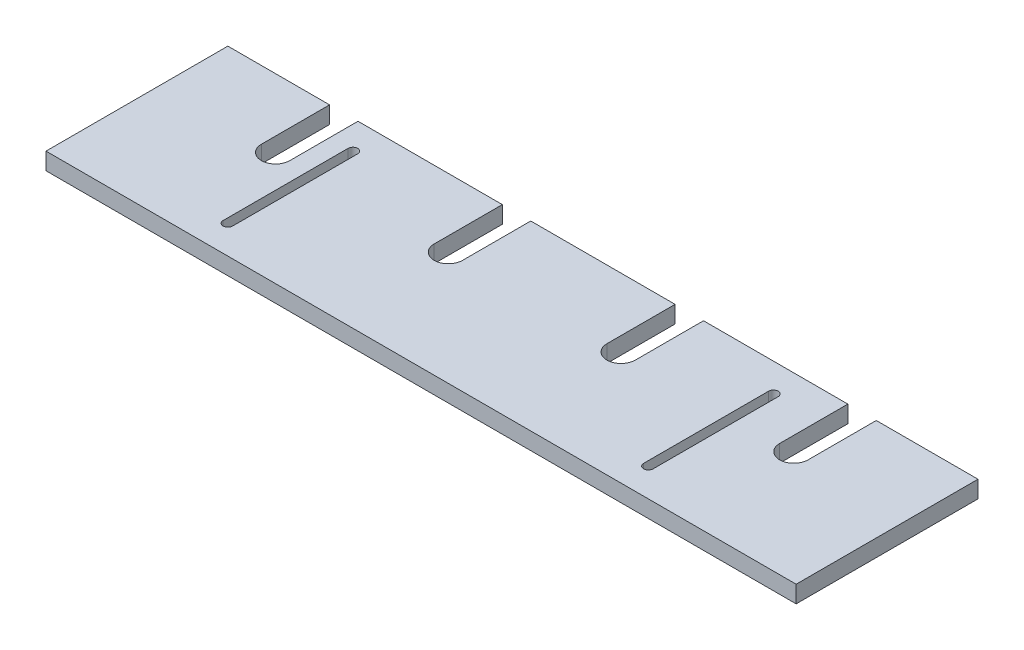
ISO-10303-21;
HEADER;
FILE_DESCRIPTION(('STEP AP214'),'2;1');
FILE_NAME('part.step','',(''),(''),'','','');
FILE_SCHEMA(('AUTOMOTIVE_DESIGN { 1 0 10303 214 1 1 1 1 }'));
ENDSEC;
DATA;
#1=APPLICATION_CONTEXT('core data for automotive mechanical design processes');
#2=APPLICATION_PROTOCOL_DEFINITION('international standard','automotive_design',2000,#1);
#3=PRODUCT_CONTEXT('',#1,'mechanical');
#4=PRODUCT('Part','Part','',(#3));
#5=PRODUCT_RELATED_PRODUCT_CATEGORY('part','',(#4));
#6=PRODUCT_DEFINITION_FORMATION('','',#4);
#7=PRODUCT_DEFINITION_CONTEXT('part definition',#1,'design');
#8=PRODUCT_DEFINITION('design','',#6,#7);
#9=PRODUCT_DEFINITION_SHAPE('','',#8);
#10=(LENGTH_UNIT() NAMED_UNIT(*) SI_UNIT(.MILLI.,.METRE.));
#11=(NAMED_UNIT(*) PLANE_ANGLE_UNIT() SI_UNIT($,.RADIAN.));
#12=(NAMED_UNIT(*) SI_UNIT($,.STERADIAN.) SOLID_ANGLE_UNIT());
#13=UNCERTAINTY_MEASURE_WITH_UNIT(LENGTH_MEASURE(1.E-05),#10,'distance_accuracy_value','');
#14=(GEOMETRIC_REPRESENTATION_CONTEXT(3) GLOBAL_UNCERTAINTY_ASSIGNED_CONTEXT((#13)) GLOBAL_UNIT_ASSIGNED_CONTEXT((#10,
#11,#12)) REPRESENTATION_CONTEXT('',''));
#15=CARTESIAN_POINT('',(0.,0.,0.));
#16=DIRECTION('',(0.,0.,1.));
#17=DIRECTION('',(1.,0.,0.));
#18=AXIS2_PLACEMENT_3D('',#15,#16,#17);
#19=CARTESIAN_POINT('',(-209.55,9.525,-50.8));
#20=DIRECTION('',(0.,0.,1.));
#21=DIRECTION('',(1.,0.,0.));
#22=AXIS2_PLACEMENT_3D('',#19,#20,#21);
#23=PLANE('',#22);
#24=DIRECTION('',(0.,-1.,0.));
#25=VECTOR('',#24,1.);
#26=CARTESIAN_POINT('',(-136.8425,9.526,-50.8));
#27=LINE('',#26,#25);
#28=CARTESIAN_POINT('',(-136.8425,0.,-50.8));
#29=VERTEX_POINT('',#28);
#30=CARTESIAN_POINT('',(-136.8425,9.525,-50.8));
#31=VERTEX_POINT('',#30);
#32=EDGE_CURVE('E334',#29,#31,#27,.F.);
#33=ORIENTED_EDGE('',*,*,#32,.T.);
#34=DIRECTION('',(-1.,0.,0.));
#35=VECTOR('',#34,1.);
#36=CARTESIAN_POINT('',(-209.55,9.525,-50.8));
#37=LINE('',#36,#35);
#38=CARTESIAN_POINT('',(-56.1975,9.525,-50.8));
#39=VERTEX_POINT('',#38);
#40=EDGE_CURVE('E539',#39,#31,#37,.T.);
#41=ORIENTED_EDGE('',*,*,#40,.F.);
#42=DIRECTION('',(0.,-1.,0.));
#43=VECTOR('',#42,1.);
#44=CARTESIAN_POINT('',(-56.1975,9.526,-50.8));
#45=LINE('',#44,#43);
#46=CARTESIAN_POINT('',(-56.1975,0.,-50.8));
#47=VERTEX_POINT('',#46);
#48=EDGE_CURVE('E374',#39,#47,#45,.T.);
#49=ORIENTED_EDGE('',*,*,#48,.T.);
#50=DIRECTION('',(-1.,0.,0.));
#51=VECTOR('',#50,1.);
#52=CARTESIAN_POINT('',(-209.55,0.,-50.8));
#53=LINE('',#52,#51);
#54=EDGE_CURVE('E588',#47,#29,#53,.T.);
#55=ORIENTED_EDGE('',*,*,#54,.T.);
#56=EDGE_LOOP('',(#33,#41,#49,#55));
#57=FACE_BOUND('',#56,.T.);
#58=ADVANCED_FACE('F50',(#57),#23,.F.);
#59=DIRECTION('',(0.,-1.,0.));
#60=VECTOR('',#59,1.);
#61=CARTESIAN_POINT('',(-152.7175,9.526,-50.8));
#62=LINE('',#61,#60);
#63=CARTESIAN_POINT('',(-152.7175,9.525,-50.8));
#64=VERTEX_POINT('',#63);
#65=CARTESIAN_POINT('',(-152.7175,0.,-50.8));
#66=VERTEX_POINT('',#65);
#67=EDGE_CURVE('E330',#64,#66,#62,.T.);
#68=ORIENTED_EDGE('',*,*,#67,.T.);
#69=CARTESIAN_POINT('',(-209.55,0.,-50.8));
#70=VERTEX_POINT('',#69);
#71=EDGE_CURVE('E496',#66,#70,#53,.T.);
#72=ORIENTED_EDGE('',*,*,#71,.T.);
#73=DIRECTION('',(0.,-1.,0.));
#74=VECTOR('',#73,1.);
#75=CARTESIAN_POINT('',(-209.55,9.525,-50.8));
#76=LINE('',#75,#74);
#77=CARTESIAN_POINT('',(-209.55,9.525,-50.8));
#78=VERTEX_POINT('',#77);
#79=EDGE_CURVE('E59',#78,#70,#76,.T.);
#80=ORIENTED_EDGE('',*,*,#79,.F.);
#81=EDGE_CURVE('E479',#64,#78,#37,.T.);
#82=ORIENTED_EDGE('',*,*,#81,.F.);
#83=EDGE_LOOP('',(#68,#72,#80,#82));
#84=FACE_BOUND('',#83,.T.);
#85=ADVANCED_FACE('F597',(#84),#23,.F.);
#86=DIRECTION('',(0.,1.,0.));
#87=VECTOR('',#86,1.);
#88=CARTESIAN_POINT('',(-40.3225,9.526,-50.8));
#89=LINE('',#88,#87);
#90=CARTESIAN_POINT('',(-40.3225,0.,-50.8));
#91=VERTEX_POINT('',#90);
#92=CARTESIAN_POINT('',(-40.3225,9.525,-50.8));
#93=VERTEX_POINT('',#92);
#94=EDGE_CURVE('E256',#91,#93,#89,.T.);
#95=ORIENTED_EDGE('',*,*,#94,.T.);
#96=CARTESIAN_POINT('',(40.3225,9.525,-50.8));
#97=VERTEX_POINT('',#96);
#98=EDGE_CURVE('E542',#97,#93,#37,.T.);
#99=ORIENTED_EDGE('',*,*,#98,.F.);
#100=DIRECTION('',(0.,1.,0.));
#101=VECTOR('',#100,1.);
#102=CARTESIAN_POINT('',(40.3225,9.526,-50.8));
#103=LINE('',#102,#101);
#104=CARTESIAN_POINT('',(40.3225,0.,-50.8));
#105=VERTEX_POINT('',#104);
#106=EDGE_CURVE('E445',#105,#97,#103,.T.);
#107=ORIENTED_EDGE('',*,*,#106,.F.);
#108=EDGE_CURVE('E575',#105,#91,#53,.T.);
#109=ORIENTED_EDGE('',*,*,#108,.T.);
#110=EDGE_LOOP('',(#95,#99,#107,#109));
#111=FACE_BOUND('',#110,.T.);
#112=ADVANCED_FACE('F573',(#111),#23,.F.);
#113=CARTESIAN_POINT('',(0.,9.525,0.));
#114=DIRECTION('',(0.,-1.,0.));
#115=DIRECTION('',(0.,0.,-1.));
#116=AXIS2_PLACEMENT_3D('',#113,#114,#115);
#117=PLANE('',#116);
#118=CARTESIAN_POINT('',(-123.825,9.525,34.925));
#119=DIRECTION('',(0.,-1.,0.));
#120=DIRECTION('',(0.,0.,-1.));
#121=AXIS2_PLACEMENT_3D('',#118,#119,#120);
#122=CIRCLE('',#121,2.66700000000001);
#123=CARTESIAN_POINT('',(-126.492,9.525,34.925));
#124=VERTEX_POINT('',#123);
#125=CARTESIAN_POINT('',(-121.158,9.525,34.925));
#126=VERTEX_POINT('',#125);
#127=EDGE_CURVE('E262',#124,#126,#122,.F.);
#128=ORIENTED_EDGE('',*,*,#127,.F.);
#129=DIRECTION('',(0.,0.,1.));
#130=VECTOR('',#129,1.);
#131=CARTESIAN_POINT('',(-126.492,9.525,0.));
#132=LINE('',#131,#130);
#133=CARTESIAN_POINT('',(-126.492,9.525,-34.925));
#134=VERTEX_POINT('',#133);
#135=EDGE_CURVE('E240',#134,#124,#132,.T.);
#136=ORIENTED_EDGE('',*,*,#135,.F.);
#137=CARTESIAN_POINT('',(-123.825,9.525,-34.925));
#138=DIRECTION('',(0.,-1.,0.));
#139=DIRECTION('',(0.,0.,-1.));
#140=AXIS2_PLACEMENT_3D('',#137,#138,#139);
#141=CIRCLE('',#140,2.66700000000001);
#142=CARTESIAN_POINT('',(-121.158,9.525,-34.925));
#143=VERTEX_POINT('',#142);
#144=EDGE_CURVE('E252',#143,#134,#141,.F.);
#145=ORIENTED_EDGE('',*,*,#144,.F.);
#146=DIRECTION('',(0.,0.,1.));
#147=VECTOR('',#146,1.);
#148=CARTESIAN_POINT('',(-121.158,9.525,0.));
#149=LINE('',#148,#147);
#150=EDGE_CURVE('E66',#143,#126,#149,.T.);
#151=ORIENTED_EDGE('',*,*,#150,.T.);
#152=EDGE_LOOP('',(#128,#136,#145,#151));
#153=FACE_BOUND('',#152,.T.);
#154=DIRECTION('',(0.,0.,1.));
#155=VECTOR('',#154,1.);
#156=CARTESIAN_POINT('',(113.792,9.525,34.925));
#157=LINE('',#156,#155);
#158=CARTESIAN_POINT('',(113.792,9.525,-34.925));
#159=VERTEX_POINT('',#158);
#160=CARTESIAN_POINT('',(113.792,9.525,34.925));
#161=VERTEX_POINT('',#160);
#162=EDGE_CURVE('E324',#159,#161,#157,.T.);
#163=ORIENTED_EDGE('',*,*,#162,.T.);
#164=CARTESIAN_POINT('',(111.125,9.525,34.925));
#165=DIRECTION('',(0.,-1.,0.));
#166=DIRECTION('',(0.,0.,-1.));
#167=AXIS2_PLACEMENT_3D('',#164,#165,#166);
#168=CIRCLE('',#167,2.667);
#169=CARTESIAN_POINT('',(108.458,9.525,34.925));
#170=VERTEX_POINT('',#169);
#171=EDGE_CURVE('E320',#170,#161,#168,.F.);
#172=ORIENTED_EDGE('',*,*,#171,.F.);
#173=DIRECTION('',(0.,0.,1.));
#174=VECTOR('',#173,1.);
#175=CARTESIAN_POINT('',(108.458,9.525,34.925));
#176=LINE('',#175,#174);
#177=CARTESIAN_POINT('',(108.458,9.525,-34.925));
#178=VERTEX_POINT('',#177);
#179=EDGE_CURVE('E288',#178,#170,#176,.T.);
#180=ORIENTED_EDGE('',*,*,#179,.F.);
#181=CARTESIAN_POINT('',(111.125,9.525,-34.925));
#182=DIRECTION('',(0.,-1.,0.));
#183=DIRECTION('',(0.,0.,-1.));
#184=AXIS2_PLACEMENT_3D('',#181,#182,#183);
#185=CIRCLE('',#184,2.667);
#186=EDGE_CURVE('E74',#159,#178,#185,.F.);
#187=ORIENTED_EDGE('',*,*,#186,.F.);
#188=EDGE_LOOP('',(#163,#172,#180,#187));
#189=FACE_BOUND('',#188,.T.);
#190=DIRECTION('',(0.,0.,1.));
#191=VECTOR('',#190,1.);
#192=CARTESIAN_POINT('',(-136.8425,9.525,-12.7));
#193=LINE('',#192,#191);
#194=CARTESIAN_POINT('',(-136.8425,9.525,-12.7));
#195=VERTEX_POINT('',#194);
#196=EDGE_CURVE('E343',#31,#195,#193,.T.);
#197=ORIENTED_EDGE('',*,*,#196,.T.);
#198=CARTESIAN_POINT('',(-144.78,9.525,-12.7));
#199=DIRECTION('',(0.,-1.,0.));
#200=DIRECTION('',(0.,0.,-1.));
#201=AXIS2_PLACEMENT_3D('',#198,#199,#200);
#202=CIRCLE('',#201,7.93749999999999);
#203=CARTESIAN_POINT('',(-152.7175,9.525,-12.7));
#204=VERTEX_POINT('',#203);
#205=EDGE_CURVE('E339',#195,#204,#202,.T.);
#206=ORIENTED_EDGE('',*,*,#205,.T.);
#207=DIRECTION('',(0.,0.,-1.));
#208=VECTOR('',#207,1.);
#209=CARTESIAN_POINT('',(-152.7175,9.525,-12.7));
#210=LINE('',#209,#208);
#211=EDGE_CURVE('E363',#204,#64,#210,.T.);
#212=ORIENTED_EDGE('',*,*,#211,.T.);
#213=ORIENTED_EDGE('',*,*,#81,.T.);
#214=DIRECTION('',(0.,0.,1.));
#215=VECTOR('',#214,1.);
#216=CARTESIAN_POINT('',(-209.55,9.525,50.8));
#217=LINE('',#216,#215);
#218=CARTESIAN_POINT('',(-209.55,9.525,50.8));
#219=VERTEX_POINT('',#218);
#220=EDGE_CURVE('E485',#78,#219,#217,.T.);
#221=ORIENTED_EDGE('',*,*,#220,.T.);
#222=DIRECTION('',(1.,0.,0.));
#223=VECTOR('',#222,1.);
#224=CARTESIAN_POINT('',(-209.55,9.525,50.8));
#225=LINE('',#224,#223);
#226=CARTESIAN_POINT('',(209.55,9.525,50.8));
#227=VERTEX_POINT('',#226);
#228=EDGE_CURVE('E489',#219,#227,#225,.T.);
#229=ORIENTED_EDGE('',*,*,#228,.T.);
#230=DIRECTION('',(0.,0.,-1.));
#231=VECTOR('',#230,1.);
#232=CARTESIAN_POINT('',(209.55,9.525,50.8));
#233=LINE('',#232,#231);
#234=CARTESIAN_POINT('',(209.55,9.525,-50.8));
#235=VERTEX_POINT('',#234);
#236=EDGE_CURVE('E475',#227,#235,#233,.T.);
#237=ORIENTED_EDGE('',*,*,#236,.T.);
#238=CARTESIAN_POINT('',(152.7175,9.525,-50.8));
#239=VERTEX_POINT('',#238);
#240=EDGE_CURVE('E481',#235,#239,#37,.T.);
#241=ORIENTED_EDGE('',*,*,#240,.T.);
#242=DIRECTION('',(0.,0.,-1.));
#243=VECTOR('',#242,1.);
#244=CARTESIAN_POINT('',(152.7175,9.525,-12.7));
#245=LINE('',#244,#243);
#246=CARTESIAN_POINT('',(152.7175,9.525,-12.7));
#247=VERTEX_POINT('',#246);
#248=EDGE_CURVE('E418',#247,#239,#245,.T.);
#249=ORIENTED_EDGE('',*,*,#248,.F.);
#250=CARTESIAN_POINT('',(144.78,9.525,-12.7));
#251=DIRECTION('',(0.,-1.,0.));
#252=DIRECTION('',(0.,0.,-1.));
#253=AXIS2_PLACEMENT_3D('',#250,#251,#252);
#254=CIRCLE('',#253,7.93749999999999);
#255=CARTESIAN_POINT('',(136.8425,9.525,-12.7));
#256=VERTEX_POINT('',#255);
#257=EDGE_CURVE('E414',#256,#247,#254,.F.);
#258=ORIENTED_EDGE('',*,*,#257,.F.);
#259=DIRECTION('',(0.,0.,1.));
#260=VECTOR('',#259,1.);
#261=CARTESIAN_POINT('',(136.8425,9.525,-12.7));
#262=LINE('',#261,#260);
#263=CARTESIAN_POINT('',(136.8425,9.525,-50.8));
#264=VERTEX_POINT('',#263);
#265=EDGE_CURVE('E435',#264,#256,#262,.T.);
#266=ORIENTED_EDGE('',*,*,#265,.F.);
#267=CARTESIAN_POINT('',(56.1975,9.525,-50.8));
#268=VERTEX_POINT('',#267);
#269=EDGE_CURVE('E486',#264,#268,#37,.T.);
#270=ORIENTED_EDGE('',*,*,#269,.T.);
#271=DIRECTION('',(0.,0.,-1.));
#272=VECTOR('',#271,1.);
#273=CARTESIAN_POINT('',(56.1975,9.525,-50.8));
#274=LINE('',#273,#272);
#275=CARTESIAN_POINT('',(56.1975,9.525,-12.7));
#276=VERTEX_POINT('',#275);
#277=EDGE_CURVE('E411',#276,#268,#274,.T.);
#278=ORIENTED_EDGE('',*,*,#277,.F.);
#279=CARTESIAN_POINT('',(48.26,9.525,-12.7));
#280=DIRECTION('',(0.,-1.,0.));
#281=DIRECTION('',(0.,0.,-1.));
#282=AXIS2_PLACEMENT_3D('',#279,#280,#281);
#283=CIRCLE('',#282,7.93749999999999);
#284=CARTESIAN_POINT('',(40.3225,9.525,-12.7));
#285=VERTEX_POINT('',#284);
#286=EDGE_CURVE('E448',#285,#276,#283,.F.);
#287=ORIENTED_EDGE('',*,*,#286,.F.);
#288=DIRECTION('',(0.,0.,1.));
#289=VECTOR('',#288,1.);
#290=CARTESIAN_POINT('',(40.3225,9.525,-50.8));
#291=LINE('',#290,#289);
#292=EDGE_CURVE('E452',#97,#285,#291,.T.);
#293=ORIENTED_EDGE('',*,*,#292,.F.);
#294=ORIENTED_EDGE('',*,*,#98,.T.);
#295=DIRECTION('',(0.,0.,1.));
#296=VECTOR('',#295,1.);
#297=CARTESIAN_POINT('',(-40.3225,9.525,-50.8));
#298=LINE('',#297,#296);
#299=CARTESIAN_POINT('',(-40.3225,9.525,-12.7));
#300=VERTEX_POINT('',#299);
#301=EDGE_CURVE('E335',#93,#300,#298,.T.);
#302=ORIENTED_EDGE('',*,*,#301,.T.);
#303=CARTESIAN_POINT('',(-48.26,9.525,-12.7));
#304=DIRECTION('',(0.,-1.,0.));
#305=DIRECTION('',(0.,0.,-1.));
#306=AXIS2_PLACEMENT_3D('',#303,#304,#305);
#307=CIRCLE('',#306,7.93749999999999);
#308=CARTESIAN_POINT('',(-56.1975,9.525,-12.7));
#309=VERTEX_POINT('',#308);
#310=EDGE_CURVE('E378',#300,#309,#307,.T.);
#311=ORIENTED_EDGE('',*,*,#310,.T.);
#312=DIRECTION('',(0.,0.,-1.));
#313=VECTOR('',#312,1.);
#314=CARTESIAN_POINT('',(-56.1975,9.525,-50.8));
#315=LINE('',#314,#313);
#316=EDGE_CURVE('E382',#309,#39,#315,.T.);
#317=ORIENTED_EDGE('',*,*,#316,.T.);
#318=ORIENTED_EDGE('',*,*,#40,.T.);
#319=EDGE_LOOP('',(#197,#206,#212,#213,#221,#229,#237,#241,#249,#258,#266,#270,#278,#287,#293,
#294,#302,#311,#317,#318));
#320=FACE_BOUND('',#319,.T.);
#321=ADVANCED_FACE('F259',(#153,#189,#320),#117,.F.);
#322=CARTESIAN_POINT('',(0.,0.,0.));
#323=DIRECTION('',(0.,-1.,0.));
#324=DIRECTION('',(0.,0.,-1.));
#325=AXIS2_PLACEMENT_3D('',#322,#323,#324);
#326=PLANE('',#325);
#327=DIRECTION('',(0.,0.,-1.));
#328=VECTOR('',#327,1.);
#329=CARTESIAN_POINT('',(-126.492,0.,0.));
#330=LINE('',#329,#328);
#331=CARTESIAN_POINT('',(-126.492,0.,34.925));
#332=VERTEX_POINT('',#331);
#333=CARTESIAN_POINT('',(-126.492,0.,-34.925));
#334=VERTEX_POINT('',#333);
#335=EDGE_CURVE('E243',#332,#334,#330,.T.);
#336=ORIENTED_EDGE('',*,*,#335,.F.);
#337=CARTESIAN_POINT('',(-123.825,0.,34.925));
#338=DIRECTION('',(0.,-1.,0.));
#339=DIRECTION('',(0.,0.,-1.));
#340=AXIS2_PLACEMENT_3D('',#337,#338,#339);
#341=CIRCLE('',#340,2.66700000000001);
#342=CARTESIAN_POINT('',(-121.158,0.,34.925));
#343=VERTEX_POINT('',#342);
#344=EDGE_CURVE('E249',#343,#332,#341,.T.);
#345=ORIENTED_EDGE('',*,*,#344,.F.);
#346=DIRECTION('',(0.,0.,-1.));
#347=VECTOR('',#346,1.);
#348=CARTESIAN_POINT('',(-121.158,0.,0.));
#349=LINE('',#348,#347);
#350=CARTESIAN_POINT('',(-121.158,0.,-34.925));
#351=VERTEX_POINT('',#350);
#352=EDGE_CURVE('E274',#343,#351,#349,.T.);
#353=ORIENTED_EDGE('',*,*,#352,.T.);
#354=CARTESIAN_POINT('',(-123.825,0.,-34.925));
#355=DIRECTION('',(0.,-1.,0.));
#356=DIRECTION('',(0.,0.,-1.));
#357=AXIS2_PLACEMENT_3D('',#354,#355,#356);
#358=CIRCLE('',#357,2.66700000000001);
#359=EDGE_CURVE('E267',#334,#351,#358,.T.);
#360=ORIENTED_EDGE('',*,*,#359,.F.);
#361=EDGE_LOOP('',(#336,#345,#353,#360));
#362=FACE_BOUND('',#361,.T.);
#363=CARTESIAN_POINT('',(111.125,0.,34.925));
#364=DIRECTION('',(0.,-1.,0.));
#365=DIRECTION('',(0.,0.,-1.));
#366=AXIS2_PLACEMENT_3D('',#363,#364,#365);
#367=CIRCLE('',#366,2.667);
#368=CARTESIAN_POINT('',(113.792,0.,34.925));
#369=VERTEX_POINT('',#368);
#370=CARTESIAN_POINT('',(108.458,0.,34.925));
#371=VERTEX_POINT('',#370);
#372=EDGE_CURVE('E317',#369,#371,#367,.T.);
#373=ORIENTED_EDGE('',*,*,#372,.F.);
#374=DIRECTION('',(0.,0.,-1.));
#375=VECTOR('',#374,1.);
#376=CARTESIAN_POINT('',(113.792,0.,34.925));
#377=LINE('',#376,#375);
#378=CARTESIAN_POINT('',(113.792,0.,-34.925));
#379=VERTEX_POINT('',#378);
#380=EDGE_CURVE('E297',#369,#379,#377,.T.);
#381=ORIENTED_EDGE('',*,*,#380,.T.);
#382=CARTESIAN_POINT('',(111.125,0.,-34.925));
#383=DIRECTION('',(0.,-1.,0.));
#384=DIRECTION('',(0.,0.,-1.));
#385=AXIS2_PLACEMENT_3D('',#382,#383,#384);
#386=CIRCLE('',#385,2.667);
#387=CARTESIAN_POINT('',(108.458,0.,-34.925));
#388=VERTEX_POINT('',#387);
#389=EDGE_CURVE('E309',#388,#379,#386,.T.);
#390=ORIENTED_EDGE('',*,*,#389,.F.);
#391=DIRECTION('',(0.,0.,-1.));
#392=VECTOR('',#391,1.);
#393=CARTESIAN_POINT('',(108.458,0.,34.925));
#394=LINE('',#393,#392);
#395=EDGE_CURVE('E313',#371,#388,#394,.T.);
#396=ORIENTED_EDGE('',*,*,#395,.F.);
#397=EDGE_LOOP('',(#373,#381,#390,#396));
#398=FACE_BOUND('',#397,.T.);
#399=CARTESIAN_POINT('',(-144.78,0.,-12.7));
#400=DIRECTION('',(0.,1.,0.));
#401=DIRECTION('',(0.,0.,-1.));
#402=AXIS2_PLACEMENT_3D('',#399,#400,#401);
#403=CIRCLE('',#402,7.93749999999999);
#404=CARTESIAN_POINT('',(-152.7175,0.,-12.7));
#405=VERTEX_POINT('',#404);
#406=CARTESIAN_POINT('',(-136.8425,0.,-12.7));
#407=VERTEX_POINT('',#406);
#408=EDGE_CURVE('E347',#405,#407,#403,.T.);
#409=ORIENTED_EDGE('',*,*,#408,.T.);
#410=DIRECTION('',(0.,0.,-1.));
#411=VECTOR('',#410,1.);
#412=CARTESIAN_POINT('',(-136.8425,0.,-12.7));
#413=LINE('',#412,#411);
#414=EDGE_CURVE('E355',#407,#29,#413,.T.);
#415=ORIENTED_EDGE('',*,*,#414,.T.);
#416=ORIENTED_EDGE('',*,*,#54,.F.);
#417=DIRECTION('',(0.,0.,1.));
#418=VECTOR('',#417,1.);
#419=CARTESIAN_POINT('',(-56.1975,0.,-50.8));
#420=LINE('',#419,#418);
#421=CARTESIAN_POINT('',(-56.1975,0.,-12.7));
#422=VERTEX_POINT('',#421);
#423=EDGE_CURVE('E394',#47,#422,#420,.T.);
#424=ORIENTED_EDGE('',*,*,#423,.T.);
#425=CARTESIAN_POINT('',(-48.26,0.,-12.7));
#426=DIRECTION('',(0.,1.,0.));
#427=DIRECTION('',(0.,0.,-1.));
#428=AXIS2_PLACEMENT_3D('',#425,#426,#427);
#429=CIRCLE('',#428,7.93749999999999);
#430=CARTESIAN_POINT('',(-40.3225,0.,-12.7));
#431=VERTEX_POINT('',#430);
#432=EDGE_CURVE('E390',#422,#431,#429,.T.);
#433=ORIENTED_EDGE('',*,*,#432,.T.);
#434=DIRECTION('',(0.,0.,-1.));
#435=VECTOR('',#434,1.);
#436=CARTESIAN_POINT('',(-40.3225,0.,-50.8));
#437=LINE('',#436,#435);
#438=EDGE_CURVE('E386',#431,#91,#437,.T.);
#439=ORIENTED_EDGE('',*,*,#438,.T.);
#440=ORIENTED_EDGE('',*,*,#108,.F.);
#441=DIRECTION('',(0.,0.,-1.));
#442=VECTOR('',#441,1.);
#443=CARTESIAN_POINT('',(40.3225,0.,-50.8));
#444=LINE('',#443,#442);
#445=CARTESIAN_POINT('',(40.3225,0.,-12.7));
#446=VERTEX_POINT('',#445);
#447=EDGE_CURVE('E464',#446,#105,#444,.T.);
#448=ORIENTED_EDGE('',*,*,#447,.F.);
#449=CARTESIAN_POINT('',(48.26,0.,-12.7));
#450=DIRECTION('',(0.,-1.,0.));
#451=DIRECTION('',(0.,0.,-1.));
#452=AXIS2_PLACEMENT_3D('',#449,#450,#451);
#453=CIRCLE('',#452,7.93749999999999);
#454=CARTESIAN_POINT('',(56.1975,0.,-12.7));
#455=VERTEX_POINT('',#454);
#456=EDGE_CURVE('E460',#455,#446,#453,.T.);
#457=ORIENTED_EDGE('',*,*,#456,.F.);
#458=DIRECTION('',(0.,0.,1.));
#459=VECTOR('',#458,1.);
#460=CARTESIAN_POINT('',(56.1975,0.,-50.8));
#461=LINE('',#460,#459);
#462=CARTESIAN_POINT('',(56.1975,0.,-50.8));
#463=VERTEX_POINT('',#462);
#464=EDGE_CURVE('E456',#463,#455,#461,.T.);
#465=ORIENTED_EDGE('',*,*,#464,.F.);
#466=CARTESIAN_POINT('',(136.8425,0.,-50.8));
#467=VERTEX_POINT('',#466);
#468=EDGE_CURVE('E502',#467,#463,#53,.T.);
#469=ORIENTED_EDGE('',*,*,#468,.F.);
#470=DIRECTION('',(0.,0.,-1.));
#471=VECTOR('',#470,1.);
#472=CARTESIAN_POINT('',(136.8425,0.,-12.7));
#473=LINE('',#472,#471);
#474=CARTESIAN_POINT('',(136.8425,0.,-12.7));
#475=VERTEX_POINT('',#474);
#476=EDGE_CURVE('E424',#475,#467,#473,.T.);
#477=ORIENTED_EDGE('',*,*,#476,.F.);
#478=CARTESIAN_POINT('',(144.78,0.,-12.7));
#479=DIRECTION('',(0.,-1.,0.));
#480=DIRECTION('',(0.,0.,-1.));
#481=AXIS2_PLACEMENT_3D('',#478,#479,#480);
#482=CIRCLE('',#481,7.93749999999999);
#483=CARTESIAN_POINT('',(152.7175,0.,-12.7));
#484=VERTEX_POINT('',#483);
#485=EDGE_CURVE('E421',#484,#475,#482,.T.);
#486=ORIENTED_EDGE('',*,*,#485,.F.);
#487=DIRECTION('',(0.,0.,1.));
#488=VECTOR('',#487,1.);
#489=CARTESIAN_POINT('',(152.7175,0.,-12.7));
#490=LINE('',#489,#488);
#491=CARTESIAN_POINT('',(152.7175,0.,-50.8));
#492=VERTEX_POINT('',#491);
#493=EDGE_CURVE('E427',#492,#484,#490,.T.);
#494=ORIENTED_EDGE('',*,*,#493,.F.);
#495=CARTESIAN_POINT('',(209.55,0.,-50.8));
#496=VERTEX_POINT('',#495);
#497=EDGE_CURVE('E497',#496,#492,#53,.T.);
#498=ORIENTED_EDGE('',*,*,#497,.F.);
#499=DIRECTION('',(0.,0.,-1.));
#500=VECTOR('',#499,1.);
#501=CARTESIAN_POINT('',(209.55,0.,50.8));
#502=LINE('',#501,#500);
#503=CARTESIAN_POINT('',(209.55,0.,50.8));
#504=VERTEX_POINT('',#503);
#505=EDGE_CURVE('E442',#504,#496,#502,.T.);
#506=ORIENTED_EDGE('',*,*,#505,.F.);
#507=DIRECTION('',(1.,0.,0.));
#508=VECTOR('',#507,1.);
#509=CARTESIAN_POINT('',(-209.55,0.,50.8));
#510=LINE('',#509,#508);
#511=CARTESIAN_POINT('',(-209.55,0.,50.8));
#512=VERTEX_POINT('',#511);
#513=EDGE_CURVE('E480',#512,#504,#510,.T.);
#514=ORIENTED_EDGE('',*,*,#513,.F.);
#515=DIRECTION('',(0.,0.,1.));
#516=VECTOR('',#515,1.);
#517=CARTESIAN_POINT('',(-209.55,0.,50.8));
#518=LINE('',#517,#516);
#519=EDGE_CURVE('E501',#70,#512,#518,.T.);
#520=ORIENTED_EDGE('',*,*,#519,.F.);
#521=ORIENTED_EDGE('',*,*,#71,.F.);
#522=DIRECTION('',(0.,0.,1.));
#523=VECTOR('',#522,1.);
#524=CARTESIAN_POINT('',(-152.7175,0.,-12.7));
#525=LINE('',#524,#523);
#526=EDGE_CURVE('E351',#66,#405,#525,.T.);
#527=ORIENTED_EDGE('',*,*,#526,.T.);
#528=EDGE_LOOP('',(#409,#415,#416,#424,#433,#439,#440,#448,#457,#465,#469,#477,#486,#494,#498,
#506,#514,#520,#521,#527));
#529=FACE_BOUND('',#528,.T.);
#530=ADVANCED_FACE('F526',(#362,#398,#529),#326,.T.);
#531=ORIENTED_EDGE('',*,*,#497,.T.);
#532=DIRECTION('',(0.,-1.,0.));
#533=VECTOR('',#532,1.);
#534=CARTESIAN_POINT('',(152.7175,9.526,-50.8));
#535=LINE('',#534,#533);
#536=EDGE_CURVE('E410',#239,#492,#535,.T.);
#537=ORIENTED_EDGE('',*,*,#536,.F.);
#538=ORIENTED_EDGE('',*,*,#240,.F.);
#539=DIRECTION('',(0.,-1.,0.));
#540=VECTOR('',#539,1.);
#541=CARTESIAN_POINT('',(209.55,9.525,-50.8));
#542=LINE('',#541,#540);
#543=EDGE_CURVE('E13',#235,#496,#542,.T.);
#544=ORIENTED_EDGE('',*,*,#543,.T.);
#545=EDGE_LOOP('',(#531,#537,#538,#544));
#546=FACE_BOUND('',#545,.T.);
#547=ADVANCED_FACE('F607',(#546),#23,.F.);
#548=CARTESIAN_POINT('',(209.55,9.525,50.8));
#549=DIRECTION('',(-1.,0.,0.));
#550=DIRECTION('',(0.,0.,1.));
#551=AXIS2_PLACEMENT_3D('',#548,#549,#550);
#552=PLANE('',#551);
#553=ORIENTED_EDGE('',*,*,#505,.T.);
#554=ORIENTED_EDGE('',*,*,#543,.F.);
#555=ORIENTED_EDGE('',*,*,#236,.F.);
#556=DIRECTION('',(0.,-1.,0.));
#557=VECTOR('',#556,1.);
#558=CARTESIAN_POINT('',(209.55,9.525,50.8));
#559=LINE('',#558,#557);
#560=EDGE_CURVE('E492',#227,#504,#559,.T.);
#561=ORIENTED_EDGE('',*,*,#560,.T.);
#562=EDGE_LOOP('',(#553,#554,#555,#561));
#563=FACE_BOUND('',#562,.T.);
#564=ADVANCED_FACE('F52',(#563),#552,.F.);
#565=ORIENTED_EDGE('',*,*,#269,.F.);
#566=DIRECTION('',(0.,1.,0.));
#567=VECTOR('',#566,1.);
#568=CARTESIAN_POINT('',(136.8425,9.526,-50.8));
#569=LINE('',#568,#567);
#570=EDGE_CURVE('E407',#467,#264,#569,.T.);
#571=ORIENTED_EDGE('',*,*,#570,.F.);
#572=ORIENTED_EDGE('',*,*,#468,.T.);
#573=DIRECTION('',(0.,-1.,0.));
#574=VECTOR('',#573,1.);
#575=CARTESIAN_POINT('',(56.1975,9.526,-50.8));
#576=LINE('',#575,#574);
#577=EDGE_CURVE('E370',#268,#463,#576,.T.);
#578=ORIENTED_EDGE('',*,*,#577,.F.);
#579=EDGE_LOOP('',(#565,#571,#572,#578));
#580=FACE_BOUND('',#579,.T.);
#581=ADVANCED_FACE('F558',(#580),#23,.F.);
#582=CARTESIAN_POINT('',(-209.55,9.525,50.8));
#583=DIRECTION('',(1.,0.,0.));
#584=DIRECTION('',(0.,0.,-1.));
#585=AXIS2_PLACEMENT_3D('',#582,#583,#584);
#586=PLANE('',#585);
#587=ORIENTED_EDGE('',*,*,#519,.T.);
#588=DIRECTION('',(0.,-1.,0.));
#589=VECTOR('',#588,1.);
#590=CARTESIAN_POINT('',(-209.55,9.525,50.8));
#591=LINE('',#590,#589);
#592=EDGE_CURVE('E510',#219,#512,#591,.T.);
#593=ORIENTED_EDGE('',*,*,#592,.F.);
#594=ORIENTED_EDGE('',*,*,#220,.F.);
#595=ORIENTED_EDGE('',*,*,#79,.T.);
#596=EDGE_LOOP('',(#587,#593,#594,#595));
#597=FACE_BOUND('',#596,.T.);
#598=ADVANCED_FACE('F519',(#597),#586,.F.);
#599=CARTESIAN_POINT('',(-209.55,9.525,50.8));
#600=DIRECTION('',(0.,0.,-1.));
#601=DIRECTION('',(-1.,0.,0.));
#602=AXIS2_PLACEMENT_3D('',#599,#600,#601);
#603=PLANE('',#602);
#604=ORIENTED_EDGE('',*,*,#513,.T.);
#605=ORIENTED_EDGE('',*,*,#560,.F.);
#606=ORIENTED_EDGE('',*,*,#228,.F.);
#607=ORIENTED_EDGE('',*,*,#592,.T.);
#608=EDGE_LOOP('',(#604,#605,#606,#607));
#609=FACE_BOUND('',#608,.T.);
#610=ADVANCED_FACE('F530',(#609),#603,.F.);
#611=CARTESIAN_POINT('',(40.3225,9.526,-50.8));
#612=DIRECTION('',(-1.,0.,0.));
#613=DIRECTION('',(0.,0.,1.));
#614=AXIS2_PLACEMENT_3D('',#611,#612,#613);
#615=PLANE('',#614);
#616=ORIENTED_EDGE('',*,*,#292,.T.);
#617=DIRECTION('',(0.,-1.,0.));
#618=VECTOR('',#617,1.);
#619=CARTESIAN_POINT('',(40.3225,9.526,-12.7));
#620=LINE('',#619,#618);
#621=EDGE_CURVE('E468',#285,#446,#620,.T.);
#622=ORIENTED_EDGE('',*,*,#621,.T.);
#623=ORIENTED_EDGE('',*,*,#447,.T.);
#624=ORIENTED_EDGE('',*,*,#106,.T.);
#625=EDGE_LOOP('',(#616,#622,#623,#624));
#626=FACE_BOUND('',#625,.T.);
#627=ADVANCED_FACE('F614',(#626),#615,.F.);
#628=CARTESIAN_POINT('',(48.26,9.526,-12.7));
#629=DIRECTION('',(0.,-1.,0.));
#630=DIRECTION('',(0.,0.,-1.));
#631=AXIS2_PLACEMENT_3D('',#628,#629,#630);
#632=CYLINDRICAL_SURFACE('',#631,7.93749999999999);
#633=ORIENTED_EDGE('',*,*,#286,.T.);
#634=DIRECTION('',(0.,-1.,0.));
#635=VECTOR('',#634,1.);
#636=CARTESIAN_POINT('',(56.1975,9.526,-12.7));
#637=LINE('',#636,#635);
#638=EDGE_CURVE('E467',#276,#455,#637,.T.);
#639=ORIENTED_EDGE('',*,*,#638,.T.);
#640=ORIENTED_EDGE('',*,*,#456,.T.);
#641=ORIENTED_EDGE('',*,*,#621,.F.);
#642=EDGE_LOOP('',(#633,#639,#640,#641));
#643=FACE_BOUND('',#642,.T.);
#644=ADVANCED_FACE('F569',(#643),#632,.F.);
#645=CARTESIAN_POINT('',(56.1975,9.526,-50.8));
#646=DIRECTION('',(1.,0.,0.));
#647=DIRECTION('',(0.,0.,-1.));
#648=AXIS2_PLACEMENT_3D('',#645,#646,#647);
#649=PLANE('',#648);
#650=ORIENTED_EDGE('',*,*,#277,.T.);
#651=ORIENTED_EDGE('',*,*,#577,.T.);
#652=ORIENTED_EDGE('',*,*,#464,.T.);
#653=ORIENTED_EDGE('',*,*,#638,.F.);
#654=EDGE_LOOP('',(#650,#651,#652,#653));
#655=FACE_BOUND('',#654,.T.);
#656=ADVANCED_FACE('F563',(#655),#649,.F.);
#657=CARTESIAN_POINT('',(144.78,9.526,-12.7));
#658=DIRECTION('',(0.,-1.,0.));
#659=DIRECTION('',(0.,0.,-1.));
#660=AXIS2_PLACEMENT_3D('',#657,#658,#659);
#661=CYLINDRICAL_SURFACE('',#660,7.93749999999999);
#662=ORIENTED_EDGE('',*,*,#257,.T.);
#663=DIRECTION('',(0.,-1.,0.));
#664=VECTOR('',#663,1.);
#665=CARTESIAN_POINT('',(152.7175,9.526,-12.7));
#666=LINE('',#665,#664);
#667=EDGE_CURVE('E432',#247,#484,#666,.T.);
#668=ORIENTED_EDGE('',*,*,#667,.T.);
#669=ORIENTED_EDGE('',*,*,#485,.T.);
#670=DIRECTION('',(0.,-1.,0.));
#671=VECTOR('',#670,1.);
#672=CARTESIAN_POINT('',(136.8425,9.526,-12.7));
#673=LINE('',#672,#671);
#674=EDGE_CURVE('E431',#256,#475,#673,.T.);
#675=ORIENTED_EDGE('',*,*,#674,.F.);
#676=EDGE_LOOP('',(#662,#668,#669,#675));
#677=FACE_BOUND('',#676,.T.);
#678=ADVANCED_FACE('F622',(#677),#661,.F.);
#679=CARTESIAN_POINT('',(152.7175,9.526,-12.7));
#680=DIRECTION('',(1.,0.,0.));
#681=DIRECTION('',(0.,0.,-1.));
#682=AXIS2_PLACEMENT_3D('',#679,#680,#681);
#683=PLANE('',#682);
#684=ORIENTED_EDGE('',*,*,#248,.T.);
#685=ORIENTED_EDGE('',*,*,#536,.T.);
#686=ORIENTED_EDGE('',*,*,#493,.T.);
#687=ORIENTED_EDGE('',*,*,#667,.F.);
#688=EDGE_LOOP('',(#684,#685,#686,#687));
#689=FACE_BOUND('',#688,.T.);
#690=ADVANCED_FACE('F629',(#689),#683,.F.);
#691=CARTESIAN_POINT('',(136.8425,9.526,-12.7));
#692=DIRECTION('',(-1.,0.,0.));
#693=DIRECTION('',(0.,0.,1.));
#694=AXIS2_PLACEMENT_3D('',#691,#692,#693);
#695=PLANE('',#694);
#696=ORIENTED_EDGE('',*,*,#265,.T.);
#697=ORIENTED_EDGE('',*,*,#674,.T.);
#698=ORIENTED_EDGE('',*,*,#476,.T.);
#699=ORIENTED_EDGE('',*,*,#570,.T.);
#700=EDGE_LOOP('',(#696,#697,#698,#699));
#701=FACE_BOUND('',#700,.T.);
#702=ADVANCED_FACE('F631',(#701),#695,.F.);
#703=CARTESIAN_POINT('',(-56.1975,9.526,-50.8));
#704=DIRECTION('',(1.,0.,0.));
#705=DIRECTION('',(0.,0.,-1.));
#706=AXIS2_PLACEMENT_3D('',#703,#704,#705);
#707=PLANE('',#706);
#708=DIRECTION('',(0.,-1.,0.));
#709=VECTOR('',#708,1.);
#710=CARTESIAN_POINT('',(-56.1975,9.526,-12.7));
#711=LINE('',#710,#709);
#712=EDGE_CURVE('E399',#309,#422,#711,.T.);
#713=ORIENTED_EDGE('',*,*,#712,.T.);
#714=ORIENTED_EDGE('',*,*,#423,.F.);
#715=ORIENTED_EDGE('',*,*,#48,.F.);
#716=ORIENTED_EDGE('',*,*,#316,.F.);
#717=EDGE_LOOP('',(#713,#714,#715,#716));
#718=FACE_BOUND('',#717,.T.);
#719=ADVANCED_FACE('F634',(#718),#707,.T.);
#720=CARTESIAN_POINT('',(-48.26,9.526,-12.7));
#721=DIRECTION('',(0.,-1.,0.));
#722=DIRECTION('',(0.,0.,-1.));
#723=AXIS2_PLACEMENT_3D('',#720,#721,#722);
#724=CYLINDRICAL_SURFACE('',#723,7.93749999999999);
#725=DIRECTION('',(0.,-1.,0.));
#726=VECTOR('',#725,1.);
#727=CARTESIAN_POINT('',(-40.3225,9.526,-12.7));
#728=LINE('',#727,#726);
#729=EDGE_CURVE('E398',#300,#431,#728,.T.);
#730=ORIENTED_EDGE('',*,*,#729,.T.);
#731=ORIENTED_EDGE('',*,*,#432,.F.);
#732=ORIENTED_EDGE('',*,*,#712,.F.);
#733=ORIENTED_EDGE('',*,*,#310,.F.);
#734=EDGE_LOOP('',(#730,#731,#732,#733));
#735=FACE_BOUND('',#734,.T.);
#736=ADVANCED_FACE('F582',(#735),#724,.F.);
#737=CARTESIAN_POINT('',(-40.3225,9.526,-50.8));
#738=DIRECTION('',(-1.,0.,0.));
#739=DIRECTION('',(0.,0.,1.));
#740=AXIS2_PLACEMENT_3D('',#737,#738,#739);
#741=PLANE('',#740);
#742=ORIENTED_EDGE('',*,*,#94,.F.);
#743=ORIENTED_EDGE('',*,*,#438,.F.);
#744=ORIENTED_EDGE('',*,*,#729,.F.);
#745=ORIENTED_EDGE('',*,*,#301,.F.);
#746=EDGE_LOOP('',(#742,#743,#744,#745));
#747=FACE_BOUND('',#746,.T.);
#748=ADVANCED_FACE('F578',(#747),#741,.T.);
#749=CARTESIAN_POINT('',(-144.78,9.526,-12.7));
#750=DIRECTION('',(0.,-1.,0.));
#751=DIRECTION('',(0.,0.,-1.));
#752=AXIS2_PLACEMENT_3D('',#749,#750,#751);
#753=CYLINDRICAL_SURFACE('',#752,7.93749999999999);
#754=DIRECTION('',(0.,-1.,0.));
#755=VECTOR('',#754,1.);
#756=CARTESIAN_POINT('',(-136.8425,9.526,-12.7));
#757=LINE('',#756,#755);
#758=EDGE_CURVE('E360',#195,#407,#757,.T.);
#759=ORIENTED_EDGE('',*,*,#758,.T.);
#760=ORIENTED_EDGE('',*,*,#408,.F.);
#761=DIRECTION('',(0.,-1.,0.));
#762=VECTOR('',#761,1.);
#763=CARTESIAN_POINT('',(-152.7175,9.526,-12.7));
#764=LINE('',#763,#762);
#765=EDGE_CURVE('E359',#204,#405,#764,.T.);
#766=ORIENTED_EDGE('',*,*,#765,.F.);
#767=ORIENTED_EDGE('',*,*,#205,.F.);
#768=EDGE_LOOP('',(#759,#760,#766,#767));
#769=FACE_BOUND('',#768,.T.);
#770=ADVANCED_FACE('F593',(#769),#753,.F.);
#771=CARTESIAN_POINT('',(-136.8425,9.526,-12.7));
#772=DIRECTION('',(-1.,0.,0.));
#773=DIRECTION('',(0.,0.,1.));
#774=AXIS2_PLACEMENT_3D('',#771,#772,#773);
#775=PLANE('',#774);
#776=ORIENTED_EDGE('',*,*,#32,.F.);
#777=ORIENTED_EDGE('',*,*,#414,.F.);
#778=ORIENTED_EDGE('',*,*,#758,.F.);
#779=ORIENTED_EDGE('',*,*,#196,.F.);
#780=EDGE_LOOP('',(#776,#777,#778,#779));
#781=FACE_BOUND('',#780,.T.);
#782=ADVANCED_FACE('F591',(#781),#775,.T.);
#783=CARTESIAN_POINT('',(-152.7175,9.526,-12.7));
#784=DIRECTION('',(1.,0.,0.));
#785=DIRECTION('',(0.,0.,-1.));
#786=AXIS2_PLACEMENT_3D('',#783,#784,#785);
#787=PLANE('',#786);
#788=ORIENTED_EDGE('',*,*,#765,.T.);
#789=ORIENTED_EDGE('',*,*,#526,.F.);
#790=ORIENTED_EDGE('',*,*,#67,.F.);
#791=ORIENTED_EDGE('',*,*,#211,.F.);
#792=EDGE_LOOP('',(#788,#789,#790,#791));
#793=FACE_BOUND('',#792,.T.);
#794=ADVANCED_FACE('F596',(#793),#787,.T.);
#795=CARTESIAN_POINT('',(111.125,9.526,34.925));
#796=DIRECTION('',(0.,-1.,0.));
#797=DIRECTION('',(0.,0.,-1.));
#798=AXIS2_PLACEMENT_3D('',#795,#796,#797);
#799=CYLINDRICAL_SURFACE('',#798,2.667);
#800=ORIENTED_EDGE('',*,*,#171,.T.);
#801=DIRECTION('',(0.,-1.,0.));
#802=VECTOR('',#801,1.);
#803=CARTESIAN_POINT('',(113.792,9.526,34.925));
#804=LINE('',#803,#802);
#805=EDGE_CURVE('E292',#161,#369,#804,.T.);
#806=ORIENTED_EDGE('',*,*,#805,.T.);
#807=ORIENTED_EDGE('',*,*,#372,.T.);
#808=DIRECTION('',(0.,-1.,0.));
#809=VECTOR('',#808,1.);
#810=CARTESIAN_POINT('',(108.458,9.526,34.925));
#811=LINE('',#810,#809);
#812=EDGE_CURVE('E293',#170,#371,#811,.T.);
#813=ORIENTED_EDGE('',*,*,#812,.F.);
#814=EDGE_LOOP('',(#800,#806,#807,#813));
#815=FACE_BOUND('',#814,.T.);
#816=ADVANCED_FACE('F649',(#815),#799,.F.);
#817=CARTESIAN_POINT('',(113.792,9.526,34.925));
#818=DIRECTION('',(-1.,0.,0.));
#819=DIRECTION('',(0.,0.,1.));
#820=AXIS2_PLACEMENT_3D('',#817,#818,#819);
#821=PLANE('',#820);
#822=DIRECTION('',(0.,-1.,0.));
#823=VECTOR('',#822,1.);
#824=CARTESIAN_POINT('',(113.792,9.526,-34.925));
#825=LINE('',#824,#823);
#826=EDGE_CURVE('E301',#159,#379,#825,.T.);
#827=ORIENTED_EDGE('',*,*,#826,.T.);
#828=ORIENTED_EDGE('',*,*,#380,.F.);
#829=ORIENTED_EDGE('',*,*,#805,.F.);
#830=ORIENTED_EDGE('',*,*,#162,.F.);
#831=EDGE_LOOP('',(#827,#828,#829,#830));
#832=FACE_BOUND('',#831,.T.);
#833=ADVANCED_FACE('F652',(#832),#821,.T.);
#834=CARTESIAN_POINT('',(111.125,9.526,-34.925));
#835=DIRECTION('',(0.,-1.,0.));
#836=DIRECTION('',(0.,0.,-1.));
#837=AXIS2_PLACEMENT_3D('',#834,#835,#836);
#838=CYLINDRICAL_SURFACE('',#837,2.667);
#839=ORIENTED_EDGE('',*,*,#186,.T.);
#840=DIRECTION('',(0.,-1.,0.));
#841=VECTOR('',#840,1.);
#842=CARTESIAN_POINT('',(108.458,9.526,-34.925));
#843=LINE('',#842,#841);
#844=EDGE_CURVE('E298',#178,#388,#843,.T.);
#845=ORIENTED_EDGE('',*,*,#844,.T.);
#846=ORIENTED_EDGE('',*,*,#389,.T.);
#847=ORIENTED_EDGE('',*,*,#826,.F.);
#848=EDGE_LOOP('',(#839,#845,#846,#847));
#849=FACE_BOUND('',#848,.T.);
#850=ADVANCED_FACE('F655',(#849),#838,.F.);
#851=CARTESIAN_POINT('',(108.458,9.526,34.925));
#852=DIRECTION('',(-1.,0.,0.));
#853=DIRECTION('',(0.,0.,1.));
#854=AXIS2_PLACEMENT_3D('',#851,#852,#853);
#855=PLANE('',#854);
#856=ORIENTED_EDGE('',*,*,#179,.T.);
#857=ORIENTED_EDGE('',*,*,#812,.T.);
#858=ORIENTED_EDGE('',*,*,#395,.T.);
#859=ORIENTED_EDGE('',*,*,#844,.F.);
#860=EDGE_LOOP('',(#856,#857,#858,#859));
#861=FACE_BOUND('',#860,.T.);
#862=ADVANCED_FACE('F659',(#861),#855,.F.);
#863=CARTESIAN_POINT('',(-126.492,9.526,0.));
#864=DIRECTION('',(-1.,0.,0.));
#865=DIRECTION('',(0.,0.,1.));
#866=AXIS2_PLACEMENT_3D('',#863,#864,#865);
#867=PLANE('',#866);
#868=ORIENTED_EDGE('',*,*,#135,.T.);
#869=DIRECTION('',(0.,-1.,0.));
#870=VECTOR('',#869,1.);
#871=CARTESIAN_POINT('',(-126.492,9.526,34.925));
#872=LINE('',#871,#870);
#873=EDGE_CURVE('E257',#124,#332,#872,.T.);
#874=ORIENTED_EDGE('',*,*,#873,.T.);
#875=ORIENTED_EDGE('',*,*,#335,.T.);
#876=DIRECTION('',(0.,-1.,0.));
#877=VECTOR('',#876,1.);
#878=CARTESIAN_POINT('',(-126.492,9.526,-34.925));
#879=LINE('',#878,#877);
#880=EDGE_CURVE('E236',#134,#334,#879,.T.);
#881=ORIENTED_EDGE('',*,*,#880,.F.);
#882=EDGE_LOOP('',(#868,#874,#875,#881));
#883=FACE_BOUND('',#882,.T.);
#884=ADVANCED_FACE('F238',(#883),#867,.F.);
#885=CARTESIAN_POINT('',(-123.825,9.526,34.925));
#886=DIRECTION('',(0.,-1.,0.));
#887=DIRECTION('',(0.,0.,-1.));
#888=AXIS2_PLACEMENT_3D('',#885,#886,#887);
#889=CYLINDRICAL_SURFACE('',#888,2.66700000000001);
#890=ORIENTED_EDGE('',*,*,#127,.T.);
#891=DIRECTION('',(0.,-1.,0.));
#892=VECTOR('',#891,1.);
#893=CARTESIAN_POINT('',(-121.158,9.526,34.925));
#894=LINE('',#893,#892);
#895=EDGE_CURVE('E283',#126,#343,#894,.T.);
#896=ORIENTED_EDGE('',*,*,#895,.T.);
#897=ORIENTED_EDGE('',*,*,#344,.T.);
#898=ORIENTED_EDGE('',*,*,#873,.F.);
#899=EDGE_LOOP('',(#890,#896,#897,#898));
#900=FACE_BOUND('',#899,.T.);
#901=ADVANCED_FACE('F668',(#900),#889,.F.);
#902=CARTESIAN_POINT('',(-121.158,9.526,0.));
#903=DIRECTION('',(-1.,0.,0.));
#904=DIRECTION('',(0.,0.,1.));
#905=AXIS2_PLACEMENT_3D('',#902,#903,#904);
#906=PLANE('',#905);
#907=DIRECTION('',(0.,-1.,0.));
#908=VECTOR('',#907,1.);
#909=CARTESIAN_POINT('',(-121.158,9.526,-34.925));
#910=LINE('',#909,#908);
#911=EDGE_CURVE('E248',#143,#351,#910,.T.);
#912=ORIENTED_EDGE('',*,*,#911,.T.);
#913=ORIENTED_EDGE('',*,*,#352,.F.);
#914=ORIENTED_EDGE('',*,*,#895,.F.);
#915=ORIENTED_EDGE('',*,*,#150,.F.);
#916=EDGE_LOOP('',(#912,#913,#914,#915));
#917=FACE_BOUND('',#916,.T.);
#918=ADVANCED_FACE('F671',(#917),#906,.T.);
#919=CARTESIAN_POINT('',(-123.825,9.526,-34.925));
#920=DIRECTION('',(0.,-1.,0.));
#921=DIRECTION('',(0.,0.,-1.));
#922=AXIS2_PLACEMENT_3D('',#919,#920,#921);
#923=CYLINDRICAL_SURFACE('',#922,2.66700000000001);
#924=ORIENTED_EDGE('',*,*,#144,.T.);
#925=ORIENTED_EDGE('',*,*,#880,.T.);
#926=ORIENTED_EDGE('',*,*,#359,.T.);
#927=ORIENTED_EDGE('',*,*,#911,.F.);
#928=EDGE_LOOP('',(#924,#925,#926,#927));
#929=FACE_BOUND('',#928,.T.);
#930=ADVANCED_FACE('F253',(#929),#923,.F.);
#931=CLOSED_SHELL('',(#58,#85,#112,#321,#530,#547,#564,#581,#598,#610,#627,#644,#656,#678,#690,
#702,#719,#736,#748,#770,#782,#794,#816,#833,#850,#862,#884,#901,#918,#930));
#932=MANIFOLD_SOLID_BREP('B2',#931);
#933=ADVANCED_BREP_SHAPE_REPRESENTATION('',(#18,#932),#14);
#934=SHAPE_DEFINITION_REPRESENTATION(#9,#933);
ENDSEC;
END-ISO-10303-21;
